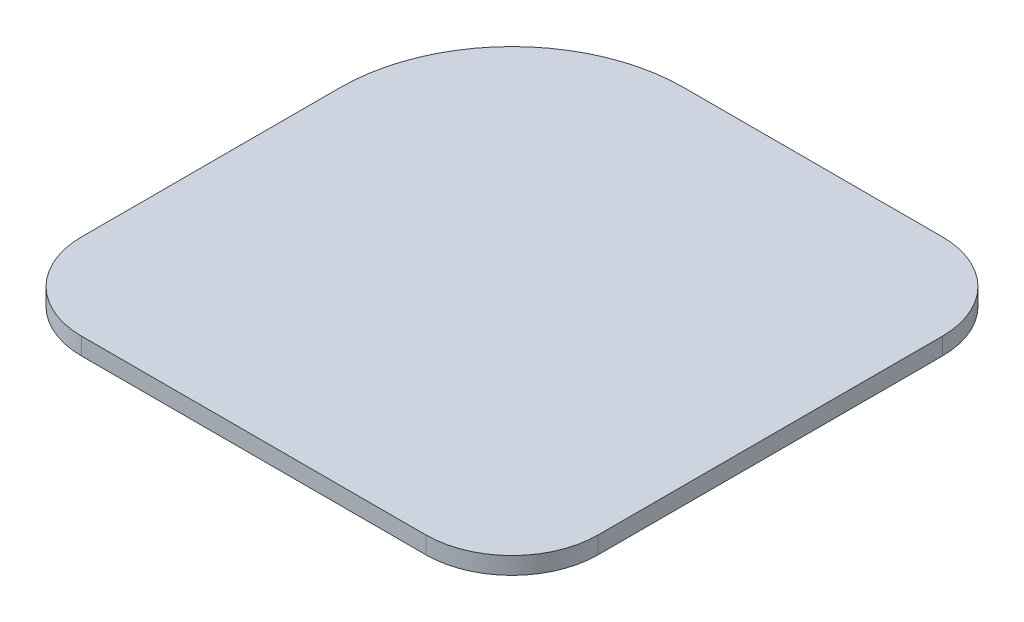
ISO-10303-21;
HEADER;
FILE_DESCRIPTION(('STEP AP214'),'2;1');
FILE_NAME('part.step','',(''),(''),'','','');
FILE_SCHEMA(('AUTOMOTIVE_DESIGN { 1 0 10303 214 1 1 1 1 }'));
ENDSEC;
DATA;
#1=APPLICATION_CONTEXT('core data for automotive mechanical design processes');
#2=APPLICATION_PROTOCOL_DEFINITION('international standard','automotive_design',2000,#1);
#3=PRODUCT_CONTEXT('',#1,'mechanical');
#4=PRODUCT('Part','Part','',(#3));
#5=PRODUCT_RELATED_PRODUCT_CATEGORY('part','',(#4));
#6=PRODUCT_DEFINITION_FORMATION('','',#4);
#7=PRODUCT_DEFINITION_CONTEXT('part definition',#1,'design');
#8=PRODUCT_DEFINITION('design','',#6,#7);
#9=PRODUCT_DEFINITION_SHAPE('','',#8);
#10=(LENGTH_UNIT() NAMED_UNIT(*) SI_UNIT(.MILLI.,.METRE.));
#11=(NAMED_UNIT(*) PLANE_ANGLE_UNIT() SI_UNIT($,.RADIAN.));
#12=(NAMED_UNIT(*) SI_UNIT($,.STERADIAN.) SOLID_ANGLE_UNIT());
#13=UNCERTAINTY_MEASURE_WITH_UNIT(LENGTH_MEASURE(1.E-05),#10,'distance_accuracy_value','');
#14=(GEOMETRIC_REPRESENTATION_CONTEXT(3) GLOBAL_UNCERTAINTY_ASSIGNED_CONTEXT((#13)) GLOBAL_UNIT_ASSIGNED_CONTEXT((#10,
#11,#12)) REPRESENTATION_CONTEXT('',''));
#15=CARTESIAN_POINT('',(0.,0.,0.));
#16=DIRECTION('',(0.,0.,1.));
#17=DIRECTION('',(1.,0.,0.));
#18=AXIS2_PLACEMENT_3D('',#15,#16,#17);
#19=CARTESIAN_POINT('',(-10.,2.,-10.));
#20=DIRECTION('',(0.,-1.,0.));
#21=DIRECTION('',(0.,0.,-1.));
#22=AXIS2_PLACEMENT_3D('',#19,#20,#21);
#23=CYLINDRICAL_SURFACE('',#22,20.);
#24=CARTESIAN_POINT('',(-10.,0.,-10.));
#25=DIRECTION('',(0.,1.,0.));
#26=DIRECTION('',(0.,0.,1.));
#27=AXIS2_PLACEMENT_3D('',#24,#25,#26);
#28=CIRCLE('',#27,20.);
#29=CARTESIAN_POINT('',(-9.99999999999986,0.,-30.));
#30=VERTEX_POINT('',#29);
#31=CARTESIAN_POINT('',(-30.,0.,-9.99999999999986));
#32=VERTEX_POINT('',#31);
#33=EDGE_CURVE('E129',#30,#32,#28,.T.);
#34=ORIENTED_EDGE('',*,*,#33,.T.);
#35=DIRECTION('',(0.,-1.,0.));
#36=VECTOR('',#35,1.);
#37=CARTESIAN_POINT('',(-30.,2.,-9.99999999999986));
#38=LINE('',#37,#36);
#39=CARTESIAN_POINT('',(-30.,2.,-9.99999999999986));
#40=VERTEX_POINT('',#39);
#41=EDGE_CURVE('E11',#40,#32,#38,.T.);
#42=ORIENTED_EDGE('',*,*,#41,.F.);
#43=CARTESIAN_POINT('',(-10.,2.,-10.));
#44=DIRECTION('',(0.,1.,0.));
#45=DIRECTION('',(0.,0.,1.));
#46=AXIS2_PLACEMENT_3D('',#43,#44,#45);
#47=CIRCLE('',#46,20.);
#48=CARTESIAN_POINT('',(-9.99999999999986,2.,-30.));
#49=VERTEX_POINT('',#48);
#50=EDGE_CURVE('E143',#49,#40,#47,.T.);
#51=ORIENTED_EDGE('',*,*,#50,.F.);
#52=DIRECTION('',(0.,-1.,0.));
#53=VECTOR('',#52,1.);
#54=CARTESIAN_POINT('',(-9.99999999999986,2.,-30.));
#55=LINE('',#54,#53);
#56=EDGE_CURVE('E125',#49,#30,#55,.T.);
#57=ORIENTED_EDGE('',*,*,#56,.T.);
#58=EDGE_LOOP('',(#34,#42,#51,#57));
#59=FACE_BOUND('',#58,.T.);
#60=ADVANCED_FACE('F33',(#59),#23,.T.);
#61=CARTESIAN_POINT('',(-30.,2.,-9.99999999999986));
#62=DIRECTION('',(1.,0.,0.));
#63=DIRECTION('',(0.,0.,-1.));
#64=AXIS2_PLACEMENT_3D('',#61,#62,#63);
#65=PLANE('',#64);
#66=DIRECTION('',(0.,0.,1.));
#67=VECTOR('',#66,1.);
#68=CARTESIAN_POINT('',(-30.,0.,-9.99999999999986));
#69=LINE('',#68,#67);
#70=CARTESIAN_POINT('',(-30.,0.,19.9999999999999));
#71=VERTEX_POINT('',#70);
#72=EDGE_CURVE('E132',#32,#71,#69,.T.);
#73=ORIENTED_EDGE('',*,*,#72,.T.);
#74=DIRECTION('',(0.,-1.,0.));
#75=VECTOR('',#74,1.);
#76=CARTESIAN_POINT('',(-30.,2.,19.9999999999999));
#77=LINE('',#76,#75);
#78=CARTESIAN_POINT('',(-30.,2.,19.9999999999999));
#79=VERTEX_POINT('',#78);
#80=EDGE_CURVE('E41',#79,#71,#77,.T.);
#81=ORIENTED_EDGE('',*,*,#80,.F.);
#82=DIRECTION('',(0.,0.,1.));
#83=VECTOR('',#82,1.);
#84=CARTESIAN_POINT('',(-30.,2.,-9.99999999999986));
#85=LINE('',#84,#83);
#86=EDGE_CURVE('E92',#40,#79,#85,.T.);
#87=ORIENTED_EDGE('',*,*,#86,.F.);
#88=ORIENTED_EDGE('',*,*,#41,.T.);
#89=EDGE_LOOP('',(#73,#81,#87,#88));
#90=FACE_BOUND('',#89,.T.);
#91=ADVANCED_FACE('F178',(#90),#65,.F.);
#92=CARTESIAN_POINT('',(-20.,2.,20.));
#93=DIRECTION('',(0.,-1.,0.));
#94=DIRECTION('',(0.,0.,-1.));
#95=AXIS2_PLACEMENT_3D('',#92,#93,#94);
#96=CYLINDRICAL_SURFACE('',#95,10.);
#97=CARTESIAN_POINT('',(-20.,0.,20.));
#98=DIRECTION('',(0.,1.,0.));
#99=DIRECTION('',(0.,0.,1.));
#100=AXIS2_PLACEMENT_3D('',#97,#98,#99);
#101=CIRCLE('',#100,10.);
#102=CARTESIAN_POINT('',(-19.9999999999999,0.,30.));
#103=VERTEX_POINT('',#102);
#104=EDGE_CURVE('E134',#71,#103,#101,.T.);
#105=ORIENTED_EDGE('',*,*,#104,.T.);
#106=DIRECTION('',(0.,-1.,0.));
#107=VECTOR('',#106,1.);
#108=CARTESIAN_POINT('',(-19.9999999999999,2.,30.));
#109=LINE('',#108,#107);
#110=CARTESIAN_POINT('',(-19.9999999999999,2.,30.));
#111=VERTEX_POINT('',#110);
#112=EDGE_CURVE('E150',#111,#103,#109,.T.);
#113=ORIENTED_EDGE('',*,*,#112,.F.);
#114=CARTESIAN_POINT('',(-20.,2.,20.));
#115=DIRECTION('',(0.,1.,0.));
#116=DIRECTION('',(0.,0.,1.));
#117=AXIS2_PLACEMENT_3D('',#114,#115,#116);
#118=CIRCLE('',#117,10.);
#119=EDGE_CURVE('E158',#79,#111,#118,.T.);
#120=ORIENTED_EDGE('',*,*,#119,.F.);
#121=ORIENTED_EDGE('',*,*,#80,.T.);
#122=EDGE_LOOP('',(#105,#113,#120,#121));
#123=FACE_BOUND('',#122,.T.);
#124=ADVANCED_FACE('F156',(#123),#96,.T.);
#125=CARTESIAN_POINT('',(-19.9999999999999,2.,30.));
#126=DIRECTION('',(0.,0.,-1.));
#127=DIRECTION('',(-1.,0.,0.));
#128=AXIS2_PLACEMENT_3D('',#125,#126,#127);
#129=PLANE('',#128);
#130=DIRECTION('',(1.,0.,0.));
#131=VECTOR('',#130,1.);
#132=CARTESIAN_POINT('',(-19.9999999999999,0.,30.));
#133=LINE('',#132,#131);
#134=CARTESIAN_POINT('',(19.9999999999999,0.,30.));
#135=VERTEX_POINT('',#134);
#136=EDGE_CURVE('E136',#103,#135,#133,.T.);
#137=ORIENTED_EDGE('',*,*,#136,.T.);
#138=DIRECTION('',(0.,-1.,0.));
#139=VECTOR('',#138,1.);
#140=CARTESIAN_POINT('',(19.9999999999999,2.,30.));
#141=LINE('',#140,#139);
#142=CARTESIAN_POINT('',(19.9999999999999,2.,30.));
#143=VERTEX_POINT('',#142);
#144=EDGE_CURVE('E147',#143,#135,#141,.T.);
#145=ORIENTED_EDGE('',*,*,#144,.F.);
#146=DIRECTION('',(1.,0.,0.));
#147=VECTOR('',#146,1.);
#148=CARTESIAN_POINT('',(-19.9999999999999,2.,30.));
#149=LINE('',#148,#147);
#150=EDGE_CURVE('E170',#111,#143,#149,.T.);
#151=ORIENTED_EDGE('',*,*,#150,.F.);
#152=ORIENTED_EDGE('',*,*,#112,.T.);
#153=EDGE_LOOP('',(#137,#145,#151,#152));
#154=FACE_BOUND('',#153,.T.);
#155=ADVANCED_FACE('F166',(#154),#129,.F.);
#156=CARTESIAN_POINT('',(20.,2.,20.));
#157=DIRECTION('',(0.,-1.,0.));
#158=DIRECTION('',(0.,0.,-1.));
#159=AXIS2_PLACEMENT_3D('',#156,#157,#158);
#160=CYLINDRICAL_SURFACE('',#159,10.);
#161=CARTESIAN_POINT('',(20.,0.,20.));
#162=DIRECTION('',(0.,1.,0.));
#163=DIRECTION('',(0.,0.,1.));
#164=AXIS2_PLACEMENT_3D('',#161,#162,#163);
#165=CIRCLE('',#164,10.);
#166=CARTESIAN_POINT('',(30.,0.,19.9999999999999));
#167=VERTEX_POINT('',#166);
#168=EDGE_CURVE('E138',#135,#167,#165,.T.);
#169=ORIENTED_EDGE('',*,*,#168,.T.);
#170=DIRECTION('',(0.,-1.,0.));
#171=VECTOR('',#170,1.);
#172=CARTESIAN_POINT('',(30.,2.,19.9999999999999));
#173=LINE('',#172,#171);
#174=CARTESIAN_POINT('',(30.,2.,19.9999999999999));
#175=VERTEX_POINT('',#174);
#176=EDGE_CURVE('E120',#175,#167,#173,.T.);
#177=ORIENTED_EDGE('',*,*,#176,.F.);
#178=CARTESIAN_POINT('',(20.,2.,20.));
#179=DIRECTION('',(0.,1.,0.));
#180=DIRECTION('',(0.,0.,1.));
#181=AXIS2_PLACEMENT_3D('',#178,#179,#180);
#182=CIRCLE('',#181,10.);
#183=EDGE_CURVE('E111',#143,#175,#182,.T.);
#184=ORIENTED_EDGE('',*,*,#183,.F.);
#185=ORIENTED_EDGE('',*,*,#144,.T.);
#186=EDGE_LOOP('',(#169,#177,#184,#185));
#187=FACE_BOUND('',#186,.T.);
#188=ADVANCED_FACE('F169',(#187),#160,.T.);
#189=CARTESIAN_POINT('',(30.,2.,-19.9999999999999));
#190=DIRECTION('',(-1.,0.,0.));
#191=DIRECTION('',(0.,0.,1.));
#192=AXIS2_PLACEMENT_3D('',#189,#190,#191);
#193=PLANE('',#192);
#194=DIRECTION('',(0.,0.,-1.));
#195=VECTOR('',#194,1.);
#196=CARTESIAN_POINT('',(30.,0.,-19.9999999999999));
#197=LINE('',#196,#195);
#198=CARTESIAN_POINT('',(30.,0.,-19.9999999999999));
#199=VERTEX_POINT('',#198);
#200=EDGE_CURVE('E119',#167,#199,#197,.T.);
#201=ORIENTED_EDGE('',*,*,#200,.T.);
#202=DIRECTION('',(0.,-1.,0.));
#203=VECTOR('',#202,1.);
#204=CARTESIAN_POINT('',(30.,2.,-19.9999999999999));
#205=LINE('',#204,#203);
#206=CARTESIAN_POINT('',(30.,2.,-19.9999999999999));
#207=VERTEX_POINT('',#206);
#208=EDGE_CURVE('E116',#207,#199,#205,.T.);
#209=ORIENTED_EDGE('',*,*,#208,.F.);
#210=DIRECTION('',(0.,0.,-1.));
#211=VECTOR('',#210,1.);
#212=CARTESIAN_POINT('',(30.,2.,-19.9999999999999));
#213=LINE('',#212,#211);
#214=EDGE_CURVE('E105',#175,#207,#213,.T.);
#215=ORIENTED_EDGE('',*,*,#214,.F.);
#216=ORIENTED_EDGE('',*,*,#176,.T.);
#217=EDGE_LOOP('',(#201,#209,#215,#216));
#218=FACE_BOUND('',#217,.T.);
#219=ADVANCED_FACE('F117',(#218),#193,.F.);
#220=CARTESIAN_POINT('',(20.,2.,-20.));
#221=DIRECTION('',(0.,-1.,0.));
#222=DIRECTION('',(0.,0.,-1.));
#223=AXIS2_PLACEMENT_3D('',#220,#221,#222);
#224=CYLINDRICAL_SURFACE('',#223,10.);
#225=CARTESIAN_POINT('',(20.,0.,-20.));
#226=DIRECTION('',(0.,1.,0.));
#227=DIRECTION('',(0.,0.,-1.));
#228=AXIS2_PLACEMENT_3D('',#225,#226,#227);
#229=CIRCLE('',#228,10.);
#230=CARTESIAN_POINT('',(19.9999999999999,0.,-30.));
#231=VERTEX_POINT('',#230);
#232=EDGE_CURVE('E78',#199,#231,#229,.T.);
#233=ORIENTED_EDGE('',*,*,#232,.T.);
#234=DIRECTION('',(0.,-1.,0.));
#235=VECTOR('',#234,1.);
#236=CARTESIAN_POINT('',(19.9999999999999,2.,-30.));
#237=LINE('',#236,#235);
#238=CARTESIAN_POINT('',(19.9999999999999,2.,-30.));
#239=VERTEX_POINT('',#238);
#240=EDGE_CURVE('E121',#239,#231,#237,.T.);
#241=ORIENTED_EDGE('',*,*,#240,.F.);
#242=CARTESIAN_POINT('',(20.,2.,-20.));
#243=DIRECTION('',(0.,1.,0.));
#244=DIRECTION('',(0.,0.,-1.));
#245=AXIS2_PLACEMENT_3D('',#242,#243,#244);
#246=CIRCLE('',#245,10.);
#247=EDGE_CURVE('E109',#207,#239,#246,.T.);
#248=ORIENTED_EDGE('',*,*,#247,.F.);
#249=ORIENTED_EDGE('',*,*,#208,.T.);
#250=EDGE_LOOP('',(#233,#241,#248,#249));
#251=FACE_BOUND('',#250,.T.);
#252=ADVANCED_FACE('F123',(#251),#224,.T.);
#253=CARTESIAN_POINT('',(-9.99999999999986,2.,-30.));
#254=DIRECTION('',(0.,0.,1.));
#255=DIRECTION('',(1.,0.,0.));
#256=AXIS2_PLACEMENT_3D('',#253,#254,#255);
#257=PLANE('',#256);
#258=DIRECTION('',(-1.,0.,0.));
#259=VECTOR('',#258,1.);
#260=CARTESIAN_POINT('',(-9.99999999999986,0.,-30.));
#261=LINE('',#260,#259);
#262=EDGE_CURVE('E84',#231,#30,#261,.T.);
#263=ORIENTED_EDGE('',*,*,#262,.T.);
#264=ORIENTED_EDGE('',*,*,#56,.F.);
#265=DIRECTION('',(-1.,0.,0.));
#266=VECTOR('',#265,1.);
#267=CARTESIAN_POINT('',(-9.99999999999986,2.,-30.));
#268=LINE('',#267,#266);
#269=EDGE_CURVE('E49',#239,#49,#268,.T.);
#270=ORIENTED_EDGE('',*,*,#269,.F.);
#271=ORIENTED_EDGE('',*,*,#240,.T.);
#272=EDGE_LOOP('',(#263,#264,#270,#271));
#273=FACE_BOUND('',#272,.T.);
#274=ADVANCED_FACE('F194',(#273),#257,.F.);
#275=CARTESIAN_POINT('',(-10.,2.,-10.));
#276=DIRECTION('',(0.,1.,0.));
#277=DIRECTION('',(0.,0.,1.));
#278=AXIS2_PLACEMENT_3D('',#275,#276,#277);
#279=PLANE('',#278);
#280=ORIENTED_EDGE('',*,*,#50,.T.);
#281=ORIENTED_EDGE('',*,*,#86,.T.);
#282=ORIENTED_EDGE('',*,*,#119,.T.);
#283=ORIENTED_EDGE('',*,*,#150,.T.);
#284=ORIENTED_EDGE('',*,*,#183,.T.);
#285=ORIENTED_EDGE('',*,*,#214,.T.);
#286=ORIENTED_EDGE('',*,*,#247,.T.);
#287=ORIENTED_EDGE('',*,*,#269,.T.);
#288=EDGE_LOOP('',(#280,#281,#282,#283,#284,#285,#286,#287));
#289=FACE_BOUND('',#288,.T.);
#290=ADVANCED_FACE('F107',(#289),#279,.T.);
#291=CARTESIAN_POINT('',(-10.,0.,-10.));
#292=DIRECTION('',(0.,1.,0.));
#293=DIRECTION('',(0.,0.,1.));
#294=AXIS2_PLACEMENT_3D('',#291,#292,#293);
#295=PLANE('',#294);
#296=ORIENTED_EDGE('',*,*,#33,.F.);
#297=ORIENTED_EDGE('',*,*,#262,.F.);
#298=ORIENTED_EDGE('',*,*,#232,.F.);
#299=ORIENTED_EDGE('',*,*,#200,.F.);
#300=ORIENTED_EDGE('',*,*,#168,.F.);
#301=ORIENTED_EDGE('',*,*,#136,.F.);
#302=ORIENTED_EDGE('',*,*,#104,.F.);
#303=ORIENTED_EDGE('',*,*,#72,.F.);
#304=EDGE_LOOP('',(#296,#297,#298,#299,#300,#301,#302,#303));
#305=FACE_BOUND('',#304,.T.);
#306=ADVANCED_FACE('F162',(#305),#295,.F.);
#307=CLOSED_SHELL('',(#60,#91,#124,#155,#188,#219,#252,#274,#290,#306));
#308=MANIFOLD_SOLID_BREP('B2',#307);
#309=ADVANCED_BREP_SHAPE_REPRESENTATION('',(#18,#308),#14);
#310=SHAPE_DEFINITION_REPRESENTATION(#9,#309);
ENDSEC;
END-ISO-10303-21;
